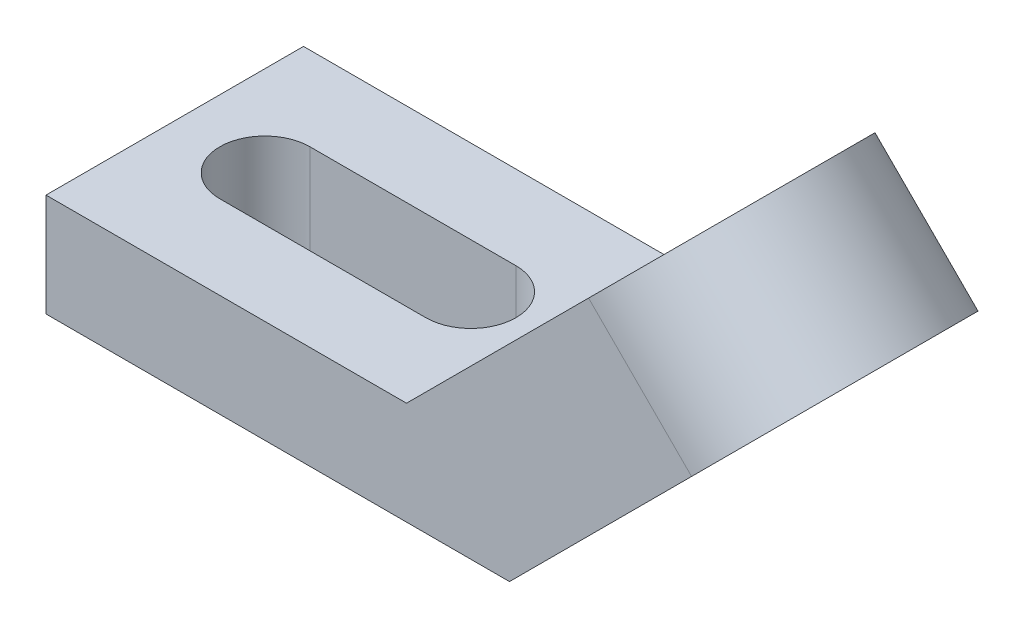
ISO-10303-21;
HEADER;
FILE_DESCRIPTION(('STEP AP214'),'2;1');
FILE_NAME('part.step','',(''),(''),'','','');
FILE_SCHEMA(('AUTOMOTIVE_DESIGN { 1 0 10303 214 1 1 1 1 }'));
ENDSEC;
DATA;
#1=APPLICATION_CONTEXT('core data for automotive mechanical design processes');
#2=APPLICATION_PROTOCOL_DEFINITION('international standard','automotive_design',2000,#1);
#3=PRODUCT_CONTEXT('',#1,'mechanical');
#4=PRODUCT('Part','Part','',(#3));
#5=PRODUCT_RELATED_PRODUCT_CATEGORY('part','',(#4));
#6=PRODUCT_DEFINITION_FORMATION('','',#4);
#7=PRODUCT_DEFINITION_CONTEXT('part definition',#1,'design');
#8=PRODUCT_DEFINITION('design','',#6,#7);
#9=PRODUCT_DEFINITION_SHAPE('','',#8);
#10=(LENGTH_UNIT() NAMED_UNIT(*) SI_UNIT(.MILLI.,.METRE.));
#11=(NAMED_UNIT(*) PLANE_ANGLE_UNIT() SI_UNIT($,.RADIAN.));
#12=(NAMED_UNIT(*) SI_UNIT($,.STERADIAN.) SOLID_ANGLE_UNIT());
#13=UNCERTAINTY_MEASURE_WITH_UNIT(LENGTH_MEASURE(1.E-05),#10,'distance_accuracy_value','');
#14=(GEOMETRIC_REPRESENTATION_CONTEXT(3) GLOBAL_UNCERTAINTY_ASSIGNED_CONTEXT((#13)) GLOBAL_UNIT_ASSIGNED_CONTEXT((#10,
#11,#12)) REPRESENTATION_CONTEXT('',''));
#15=CARTESIAN_POINT('',(0.,0.,0.));
#16=DIRECTION('',(0.,0.,1.));
#17=DIRECTION('',(1.,0.,0.));
#18=AXIS2_PLACEMENT_3D('',#15,#16,#17);
#19=CARTESIAN_POINT('',(50.1421356237309,6.14213562373097,-10.));
#20=DIRECTION('',(-0.707106781186549,0.707106781186546,0.));
#21=DIRECTION('',(-0.707106781186546,-0.707106781186549,0.));
#22=AXIS2_PLACEMENT_3D('',#19,#20,#21);
#23=CYLINDRICAL_SURFACE('',#22,10.);
#24=DIRECTION('',(-0.707106781186549,0.707106781186546,0.));
#25=VECTOR('',#24,1.);
#26=CARTESIAN_POINT('',(28.1421356237308,28.142135623731,0.));
#27=LINE('',#26,#25);
#28=CARTESIAN_POINT('',(50.1421356237309,6.14213562373097,0.));
#29=VERTEX_POINT('',#28);
#30=CARTESIAN_POINT('',(42.1421356237309,14.142135623731,0.));
#31=VERTEX_POINT('',#30);
#32=EDGE_CURVE('E217',#29,#31,#27,.T.);
#33=ORIENTED_EDGE('',*,*,#32,.F.);
#34=CARTESIAN_POINT('',(50.1421356237309,6.14213562373097,-10.));
#35=DIRECTION('',(0.707106781186549,-0.707106781186546,0.));
#36=DIRECTION('',(0.707106781186546,0.707106781186549,0.));
#37=AXIS2_PLACEMENT_3D('',#34,#35,#36);
#38=CIRCLE('',#37,10.);
#39=CARTESIAN_POINT('',(50.1421356237309,6.14213562373097,-20.));
#40=VERTEX_POINT('',#39);
#41=EDGE_CURVE('E55',#40,#29,#38,.T.);
#42=ORIENTED_EDGE('',*,*,#41,.F.);
#43=DIRECTION('',(0.707106781186549,-0.707106781186546,0.));
#44=VECTOR('',#43,1.);
#45=CARTESIAN_POINT('',(50.1421356237309,6.14213562373097,-20.));
#46=LINE('',#45,#44);
#47=CARTESIAN_POINT('',(42.1421356237309,14.142135623731,-20.));
#48=VERTEX_POINT('',#47);
#49=EDGE_CURVE('E230',#48,#40,#46,.T.);
#50=ORIENTED_EDGE('',*,*,#49,.F.);
#51=CARTESIAN_POINT('',(42.1421356237309,14.142135623731,-10.));
#52=DIRECTION('',(-0.707106781186549,0.707106781186546,0.));
#53=DIRECTION('',(-0.707106781186546,-0.707106781186549,0.));
#54=AXIS2_PLACEMENT_3D('',#51,#52,#53);
#55=CIRCLE('',#54,10.);
#56=EDGE_CURVE('E11',#31,#48,#55,.T.);
#57=ORIENTED_EDGE('',*,*,#56,.F.);
#58=EDGE_LOOP('',(#33,#42,#50,#57));
#59=FACE_BOUND('',#58,.T.);
#60=ADVANCED_FACE('F45',(#59),#23,.T.);
#61=CARTESIAN_POINT('',(0.,0.,-20.));
#62=DIRECTION('',(-1.,0.,0.));
#63=DIRECTION('',(0.,-1.,0.));
#64=AXIS2_PLACEMENT_3D('',#61,#62,#63);
#65=PLANE('',#64);
#66=DIRECTION('',(0.,-1.,0.));
#67=VECTOR('',#66,1.);
#68=CARTESIAN_POINT('',(0.,0.,0.));
#69=LINE('',#68,#67);
#70=CARTESIAN_POINT('',(0.,0.,0.));
#71=VERTEX_POINT('',#70);
#72=CARTESIAN_POINT('',(0.,-8.,0.));
#73=VERTEX_POINT('',#72);
#74=EDGE_CURVE('E196',#71,#73,#69,.T.);
#75=ORIENTED_EDGE('',*,*,#74,.F.);
#76=DIRECTION('',(0.,0.,1.));
#77=VECTOR('',#76,1.);
#78=CARTESIAN_POINT('',(0.,0.,-20.));
#79=LINE('',#78,#77);
#80=CARTESIAN_POINT('',(0.,0.,-20.));
#81=VERTEX_POINT('',#80);
#82=EDGE_CURVE('E214',#81,#71,#79,.T.);
#83=ORIENTED_EDGE('',*,*,#82,.F.);
#84=DIRECTION('',(0.,-1.,0.));
#85=VECTOR('',#84,1.);
#86=CARTESIAN_POINT('',(0.,0.,-20.));
#87=LINE('',#86,#85);
#88=CARTESIAN_POINT('',(0.,-8.,-20.));
#89=VERTEX_POINT('',#88);
#90=EDGE_CURVE('E175',#81,#89,#87,.T.);
#91=ORIENTED_EDGE('',*,*,#90,.T.);
#92=DIRECTION('',(0.,0.,1.));
#93=VECTOR('',#92,1.);
#94=CARTESIAN_POINT('',(0.,-8.,-20.));
#95=LINE('',#94,#93);
#96=EDGE_CURVE('E195',#89,#73,#95,.T.);
#97=ORIENTED_EDGE('',*,*,#96,.T.);
#98=EDGE_LOOP('',(#75,#83,#91,#97));
#99=FACE_BOUND('',#98,.T.);
#100=ADVANCED_FACE('F260',(#99),#65,.T.);
#101=CARTESIAN_POINT('',(0.,0.,-20.));
#102=DIRECTION('',(0.,1.,0.));
#103=DIRECTION('',(0.,0.,1.));
#104=AXIS2_PLACEMENT_3D('',#101,#102,#103);
#105=PLANE('',#104);
#106=CARTESIAN_POINT('',(7.,0.,-10.));
#107=DIRECTION('',(0.,1.,0.));
#108=DIRECTION('',(0.,0.,1.));
#109=AXIS2_PLACEMENT_3D('',#106,#107,#108);
#110=CIRCLE('',#109,3.5);
#111=CARTESIAN_POINT('',(7.,0.,-13.5));
#112=VERTEX_POINT('',#111);
#113=CARTESIAN_POINT('',(7.,0.,-6.5));
#114=VERTEX_POINT('',#113);
#115=EDGE_CURVE('E62',#112,#114,#110,.T.);
#116=ORIENTED_EDGE('',*,*,#115,.F.);
#117=DIRECTION('',(1.,0.,0.));
#118=VECTOR('',#117,1.);
#119=CARTESIAN_POINT('',(7.,0.,-13.5));
#120=LINE('',#119,#118);
#121=CARTESIAN_POINT('',(23.,0.,-13.5));
#122=VERTEX_POINT('',#121);
#123=EDGE_CURVE('E144',#112,#122,#120,.T.);
#124=ORIENTED_EDGE('',*,*,#123,.T.);
#125=CARTESIAN_POINT('',(23.,0.,-10.));
#126=DIRECTION('',(0.,1.,0.));
#127=DIRECTION('',(0.,0.,1.));
#128=AXIS2_PLACEMENT_3D('',#125,#126,#127);
#129=CIRCLE('',#128,3.5);
#130=CARTESIAN_POINT('',(23.,0.,-6.5));
#131=VERTEX_POINT('',#130);
#132=EDGE_CURVE('E148',#131,#122,#129,.T.);
#133=ORIENTED_EDGE('',*,*,#132,.F.);
#134=DIRECTION('',(1.,0.,0.));
#135=VECTOR('',#134,1.);
#136=CARTESIAN_POINT('',(7.,0.,-6.5));
#137=LINE('',#136,#135);
#138=EDGE_CURVE('E157',#114,#131,#137,.T.);
#139=ORIENTED_EDGE('',*,*,#138,.F.);
#140=EDGE_LOOP('',(#116,#124,#133,#139));
#141=FACE_BOUND('',#140,.T.);
#142=DIRECTION('',(-1.,0.,0.));
#143=VECTOR('',#142,1.);
#144=CARTESIAN_POINT('',(0.,0.,0.));
#145=LINE('',#144,#143);
#146=CARTESIAN_POINT('',(28.,0.,0.));
#147=VERTEX_POINT('',#146);
#148=EDGE_CURVE('E180',#147,#71,#145,.T.);
#149=ORIENTED_EDGE('',*,*,#148,.F.);
#150=DIRECTION('',(0.,0.,1.));
#151=VECTOR('',#150,1.);
#152=CARTESIAN_POINT('',(28.,0.,-20.));
#153=LINE('',#152,#151);
#154=CARTESIAN_POINT('',(28.,0.,-20.));
#155=VERTEX_POINT('',#154);
#156=EDGE_CURVE('E218',#155,#147,#153,.T.);
#157=ORIENTED_EDGE('',*,*,#156,.F.);
#158=DIRECTION('',(-1.,0.,0.));
#159=VECTOR('',#158,1.);
#160=CARTESIAN_POINT('',(0.,0.,-20.));
#161=LINE('',#160,#159);
#162=EDGE_CURVE('E191',#155,#81,#161,.T.);
#163=ORIENTED_EDGE('',*,*,#162,.T.);
#164=ORIENTED_EDGE('',*,*,#82,.T.);
#165=EDGE_LOOP('',(#149,#157,#163,#164));
#166=FACE_BOUND('',#165,.T.);
#167=ADVANCED_FACE('F258',(#141,#166),#105,.T.);
#168=CARTESIAN_POINT('',(28.,0.,-20.));
#169=DIRECTION('',(-0.707106781186549,0.707106781186546,0.));
#170=DIRECTION('',(-0.707106781186546,-0.707106781186549,0.));
#171=AXIS2_PLACEMENT_3D('',#168,#169,#170);
#172=PLANE('',#171);
#173=CARTESIAN_POINT('',(42.1421356237309,14.142135623731,-10.));
#174=DIRECTION('',(-0.707106781186549,0.707106781186546,0.));
#175=DIRECTION('',(-0.707106781186546,-0.707106781186549,0.));
#176=AXIS2_PLACEMENT_3D('',#173,#174,#175);
#177=CIRCLE('',#176,6.);
#178=CARTESIAN_POINT('',(37.8994949366116,9.89949493661168,-10.));
#179=VERTEX_POINT('',#178);
#180=EDGE_CURVE('E166',#179,#179,#177,.T.);
#181=ORIENTED_EDGE('',*,*,#180,.F.);
#182=EDGE_LOOP('',(#181));
#183=FACE_BOUND('',#182,.T.);
#184=DIRECTION('',(-0.707106781186546,-0.707106781186549,0.));
#185=VECTOR('',#184,1.);
#186=CARTESIAN_POINT('',(28.,0.,0.));
#187=LINE('',#186,#185);
#188=EDGE_CURVE('E208',#31,#147,#187,.T.);
#189=ORIENTED_EDGE('',*,*,#188,.F.);
#190=ORIENTED_EDGE('',*,*,#56,.T.);
#191=DIRECTION('',(-0.707106781186546,-0.707106781186549,0.));
#192=VECTOR('',#191,1.);
#193=CARTESIAN_POINT('',(28.,0.,-20.));
#194=LINE('',#193,#192);
#195=EDGE_CURVE('E188',#48,#155,#194,.T.);
#196=ORIENTED_EDGE('',*,*,#195,.T.);
#197=ORIENTED_EDGE('',*,*,#156,.T.);
#198=EDGE_LOOP('',(#189,#190,#196,#197));
#199=FACE_BOUND('',#198,.T.);
#200=ADVANCED_FACE('F255',(#183,#199),#172,.T.);
#201=CARTESIAN_POINT('',(36.,-8.,-20.));
#202=DIRECTION('',(0.707106781186549,-0.707106781186546,0.));
#203=DIRECTION('',(0.707106781186546,0.707106781186549,0.));
#204=AXIS2_PLACEMENT_3D('',#201,#202,#203);
#205=PLANE('',#204);
#206=CARTESIAN_POINT('',(50.1421356237309,6.14213562373097,-10.));
#207=DIRECTION('',(0.707106781186549,-0.707106781186546,0.));
#208=DIRECTION('',(0.707106781186546,0.707106781186549,0.));
#209=AXIS2_PLACEMENT_3D('',#206,#207,#208);
#210=CIRCLE('',#209,6.);
#211=CARTESIAN_POINT('',(54.3847763108502,10.3847763108503,-10.));
#212=VERTEX_POINT('',#211);
#213=EDGE_CURVE('E49',#212,#212,#210,.T.);
#214=ORIENTED_EDGE('',*,*,#213,.F.);
#215=EDGE_LOOP('',(#214));
#216=FACE_BOUND('',#215,.T.);
#217=DIRECTION('',(0.707106781186546,0.707106781186549,0.));
#218=VECTOR('',#217,1.);
#219=CARTESIAN_POINT('',(36.,-8.,-20.));
#220=LINE('',#219,#218);
#221=CARTESIAN_POINT('',(36.,-8.,-20.));
#222=VERTEX_POINT('',#221);
#223=EDGE_CURVE('E184',#222,#40,#220,.T.);
#224=ORIENTED_EDGE('',*,*,#223,.T.);
#225=ORIENTED_EDGE('',*,*,#41,.T.);
#226=DIRECTION('',(0.707106781186546,0.707106781186549,0.));
#227=VECTOR('',#226,1.);
#228=CARTESIAN_POINT('',(36.,-8.,0.));
#229=LINE('',#228,#227);
#230=CARTESIAN_POINT('',(36.,-8.,0.));
#231=VERTEX_POINT('',#230);
#232=EDGE_CURVE('E204',#231,#29,#229,.T.);
#233=ORIENTED_EDGE('',*,*,#232,.F.);
#234=DIRECTION('',(0.,0.,1.));
#235=VECTOR('',#234,1.);
#236=CARTESIAN_POINT('',(36.,-8.,-20.));
#237=LINE('',#236,#235);
#238=EDGE_CURVE('E222',#222,#231,#237,.T.);
#239=ORIENTED_EDGE('',*,*,#238,.F.);
#240=EDGE_LOOP('',(#224,#225,#233,#239));
#241=FACE_BOUND('',#240,.T.);
#242=ADVANCED_FACE('F238',(#216,#241),#205,.T.);
#243=CARTESIAN_POINT('',(0.,-8.,-20.));
#244=DIRECTION('',(0.,-1.,0.));
#245=DIRECTION('',(0.,0.,-1.));
#246=AXIS2_PLACEMENT_3D('',#243,#244,#245);
#247=PLANE('',#246);
#248=CARTESIAN_POINT('',(7.,-8.,-10.));
#249=DIRECTION('',(0.,1.,0.));
#250=DIRECTION('',(0.,0.,1.));
#251=AXIS2_PLACEMENT_3D('',#248,#249,#250);
#252=CIRCLE('',#251,3.5);
#253=CARTESIAN_POINT('',(7.,-8.,-13.5));
#254=VERTEX_POINT('',#253);
#255=CARTESIAN_POINT('',(7.,-8.,-6.5));
#256=VERTEX_POINT('',#255);
#257=EDGE_CURVE('E126',#254,#256,#252,.T.);
#258=ORIENTED_EDGE('',*,*,#257,.T.);
#259=DIRECTION('',(1.,0.,0.));
#260=VECTOR('',#259,1.);
#261=CARTESIAN_POINT('',(7.,-8.,-6.5));
#262=LINE('',#261,#260);
#263=CARTESIAN_POINT('',(23.,-8.,-6.5));
#264=VERTEX_POINT('',#263);
#265=EDGE_CURVE('E136',#256,#264,#262,.T.);
#266=ORIENTED_EDGE('',*,*,#265,.T.);
#267=CARTESIAN_POINT('',(23.,-8.,-10.));
#268=DIRECTION('',(0.,1.,0.));
#269=DIRECTION('',(0.,0.,1.));
#270=AXIS2_PLACEMENT_3D('',#267,#268,#269);
#271=CIRCLE('',#270,3.5);
#272=CARTESIAN_POINT('',(23.,-8.,-13.5));
#273=VERTEX_POINT('',#272);
#274=EDGE_CURVE('E70',#264,#273,#271,.T.);
#275=ORIENTED_EDGE('',*,*,#274,.T.);
#276=DIRECTION('',(1.,0.,0.));
#277=VECTOR('',#276,1.);
#278=CARTESIAN_POINT('',(7.,-8.,-13.5));
#279=LINE('',#278,#277);
#280=EDGE_CURVE('E133',#254,#273,#279,.T.);
#281=ORIENTED_EDGE('',*,*,#280,.F.);
#282=EDGE_LOOP('',(#258,#266,#275,#281));
#283=FACE_BOUND('',#282,.T.);
#284=DIRECTION('',(1.,0.,0.));
#285=VECTOR('',#284,1.);
#286=CARTESIAN_POINT('',(0.,-8.,0.));
#287=LINE('',#286,#285);
#288=EDGE_CURVE('E200',#73,#231,#287,.T.);
#289=ORIENTED_EDGE('',*,*,#288,.F.);
#290=ORIENTED_EDGE('',*,*,#96,.F.);
#291=DIRECTION('',(1.,0.,0.));
#292=VECTOR('',#291,1.);
#293=CARTESIAN_POINT('',(0.,-8.,-20.));
#294=LINE('',#293,#292);
#295=EDGE_CURVE('E179',#89,#222,#294,.T.);
#296=ORIENTED_EDGE('',*,*,#295,.T.);
#297=ORIENTED_EDGE('',*,*,#238,.T.);
#298=EDGE_LOOP('',(#289,#290,#296,#297));
#299=FACE_BOUND('',#298,.T.);
#300=ADVANCED_FACE('F141',(#283,#299),#247,.T.);
#301=CARTESIAN_POINT('',(0.,0.,-20.));
#302=DIRECTION('',(0.,0.,1.));
#303=DIRECTION('',(1.,0.,0.));
#304=AXIS2_PLACEMENT_3D('',#301,#302,#303);
#305=PLANE('',#304);
#306=ORIENTED_EDGE('',*,*,#195,.F.);
#307=ORIENTED_EDGE('',*,*,#49,.T.);
#308=ORIENTED_EDGE('',*,*,#223,.F.);
#309=ORIENTED_EDGE('',*,*,#295,.F.);
#310=ORIENTED_EDGE('',*,*,#90,.F.);
#311=ORIENTED_EDGE('',*,*,#162,.F.);
#312=EDGE_LOOP('',(#306,#307,#308,#309,#310,#311));
#313=FACE_BOUND('',#312,.T.);
#314=ADVANCED_FACE('F250',(#313),#305,.F.);
#315=CARTESIAN_POINT('',(0.,0.,0.));
#316=DIRECTION('',(0.,0.,1.));
#317=DIRECTION('',(1.,0.,0.));
#318=AXIS2_PLACEMENT_3D('',#315,#316,#317);
#319=PLANE('',#318);
#320=ORIENTED_EDGE('',*,*,#232,.T.);
#321=ORIENTED_EDGE('',*,*,#32,.T.);
#322=ORIENTED_EDGE('',*,*,#188,.T.);
#323=ORIENTED_EDGE('',*,*,#148,.T.);
#324=ORIENTED_EDGE('',*,*,#74,.T.);
#325=ORIENTED_EDGE('',*,*,#288,.T.);
#326=EDGE_LOOP('',(#320,#321,#322,#323,#324,#325));
#327=FACE_BOUND('',#326,.T.);
#328=ADVANCED_FACE('F244',(#327),#319,.T.);
#329=CARTESIAN_POINT('',(60.7487373415292,-4.46446609406722,-10.));
#330=DIRECTION('',(-0.707106781186549,0.707106781186546,0.));
#331=DIRECTION('',(-0.707106781186546,-0.707106781186549,0.));
#332=AXIS2_PLACEMENT_3D('',#329,#330,#331);
#333=CYLINDRICAL_SURFACE('',#332,6.);
#334=ORIENTED_EDGE('',*,*,#213,.T.);
#335=EDGE_LOOP('',(#334));
#336=FACE_BOUND('',#335,.T.);
#337=ORIENTED_EDGE('',*,*,#180,.T.);
#338=EDGE_LOOP('',(#337));
#339=FACE_BOUND('',#338,.T.);
#340=ADVANCED_FACE('F279',(#336,#339),#333,.F.);
#341=CARTESIAN_POINT('',(7.,-8.,-10.));
#342=DIRECTION('',(0.,1.,0.));
#343=DIRECTION('',(0.,0.,1.));
#344=AXIS2_PLACEMENT_3D('',#341,#342,#343);
#345=CYLINDRICAL_SURFACE('',#344,3.5);
#346=ORIENTED_EDGE('',*,*,#115,.T.);
#347=DIRECTION('',(0.,1.,0.));
#348=VECTOR('',#347,1.);
#349=CARTESIAN_POINT('',(7.,-8.,-6.5));
#350=LINE('',#349,#348);
#351=EDGE_CURVE('E122',#256,#114,#350,.T.);
#352=ORIENTED_EDGE('',*,*,#351,.F.);
#353=ORIENTED_EDGE('',*,*,#257,.F.);
#354=DIRECTION('',(0.,1.,0.));
#355=VECTOR('',#354,1.);
#356=CARTESIAN_POINT('',(7.,-8.,-13.5));
#357=LINE('',#356,#355);
#358=EDGE_CURVE('E163',#254,#112,#357,.T.);
#359=ORIENTED_EDGE('',*,*,#358,.T.);
#360=EDGE_LOOP('',(#346,#352,#353,#359));
#361=FACE_BOUND('',#360,.T.);
#362=ADVANCED_FACE('F124',(#361),#345,.F.);
#363=CARTESIAN_POINT('',(7.,-8.,-13.5));
#364=DIRECTION('',(0.,0.,1.));
#365=DIRECTION('',(1.,0.,0.));
#366=AXIS2_PLACEMENT_3D('',#363,#364,#365);
#367=PLANE('',#366);
#368=ORIENTED_EDGE('',*,*,#123,.F.);
#369=ORIENTED_EDGE('',*,*,#358,.F.);
#370=ORIENTED_EDGE('',*,*,#280,.T.);
#371=DIRECTION('',(0.,1.,0.));
#372=VECTOR('',#371,1.);
#373=CARTESIAN_POINT('',(23.,-8.,-13.5));
#374=LINE('',#373,#372);
#375=EDGE_CURVE('E167',#273,#122,#374,.T.);
#376=ORIENTED_EDGE('',*,*,#375,.T.);
#377=EDGE_LOOP('',(#368,#369,#370,#376));
#378=FACE_BOUND('',#377,.T.);
#379=ADVANCED_FACE('F287',(#378),#367,.T.);
#380=CARTESIAN_POINT('',(23.,-8.,-10.));
#381=DIRECTION('',(0.,1.,0.));
#382=DIRECTION('',(0.,0.,1.));
#383=AXIS2_PLACEMENT_3D('',#380,#381,#382);
#384=CYLINDRICAL_SURFACE('',#383,3.5);
#385=ORIENTED_EDGE('',*,*,#132,.T.);
#386=ORIENTED_EDGE('',*,*,#375,.F.);
#387=ORIENTED_EDGE('',*,*,#274,.F.);
#388=DIRECTION('',(0.,1.,0.));
#389=VECTOR('',#388,1.);
#390=CARTESIAN_POINT('',(23.,-8.,-6.5));
#391=LINE('',#390,#389);
#392=EDGE_CURVE('E132',#264,#131,#391,.T.);
#393=ORIENTED_EDGE('',*,*,#392,.T.);
#394=EDGE_LOOP('',(#385,#386,#387,#393));
#395=FACE_BOUND('',#394,.T.);
#396=ADVANCED_FACE('F290',(#395),#384,.F.);
#397=CARTESIAN_POINT('',(7.,-8.,-6.5));
#398=DIRECTION('',(0.,0.,1.));
#399=DIRECTION('',(1.,0.,0.));
#400=AXIS2_PLACEMENT_3D('',#397,#398,#399);
#401=PLANE('',#400);
#402=ORIENTED_EDGE('',*,*,#138,.T.);
#403=ORIENTED_EDGE('',*,*,#392,.F.);
#404=ORIENTED_EDGE('',*,*,#265,.F.);
#405=ORIENTED_EDGE('',*,*,#351,.T.);
#406=EDGE_LOOP('',(#402,#403,#404,#405));
#407=FACE_BOUND('',#406,.T.);
#408=ADVANCED_FACE('F137',(#407),#401,.F.);
#409=CLOSED_SHELL('',(#60,#100,#167,#200,#242,#300,#314,#328,#340,#362,#379,#396,#408));
#410=MANIFOLD_SOLID_BREP('B2',#409);
#411=ADVANCED_BREP_SHAPE_REPRESENTATION('',(#18,#410),#14);
#412=SHAPE_DEFINITION_REPRESENTATION(#9,#411);
ENDSEC;
END-ISO-10303-21;
